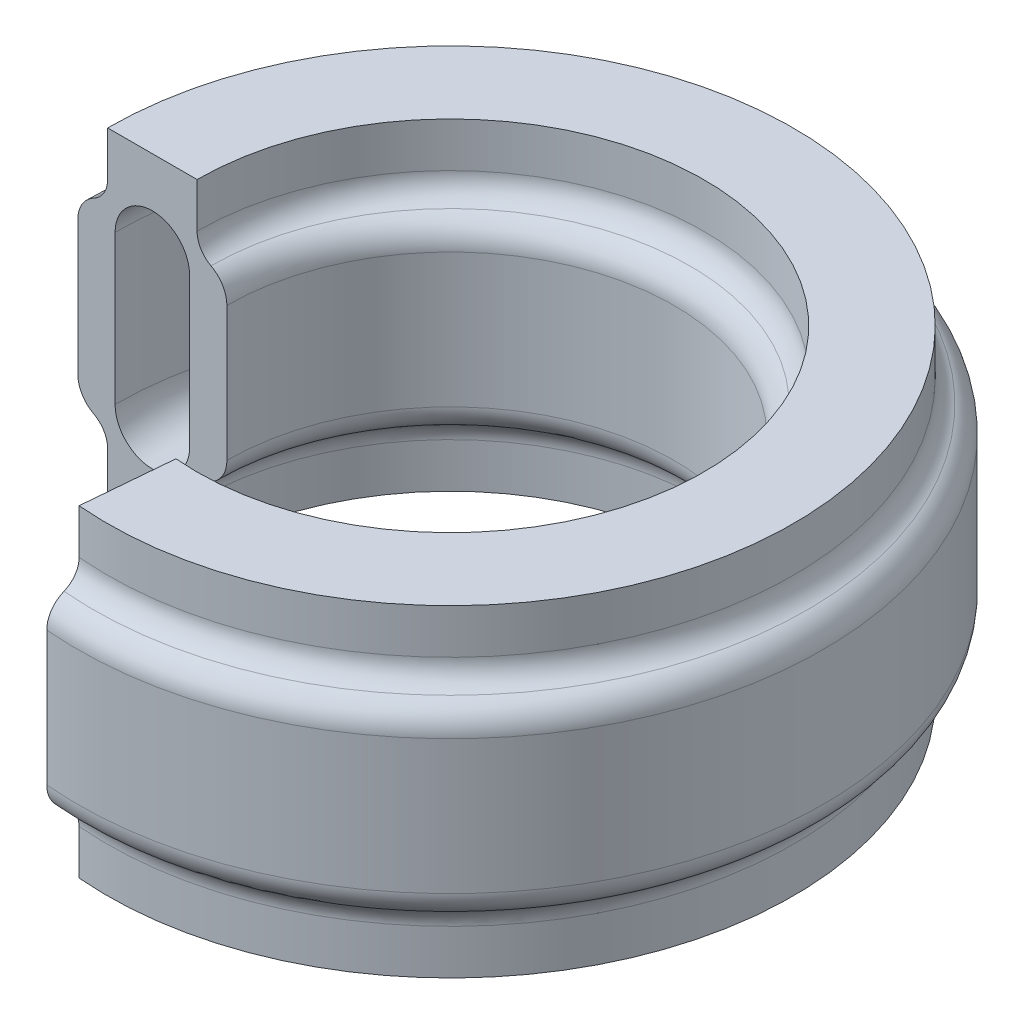
ISO-10303-21;
HEADER;
FILE_DESCRIPTION(('STEP AP214'),'2;1');
FILE_NAME('part.step','',(''),(''),'','','');
FILE_SCHEMA(('AUTOMOTIVE_DESIGN { 1 0 10303 214 1 1 1 1 }'));
ENDSEC;
DATA;
#1=APPLICATION_CONTEXT('core data for automotive mechanical design processes');
#2=APPLICATION_PROTOCOL_DEFINITION('international standard','automotive_design',2000,#1);
#3=PRODUCT_CONTEXT('',#1,'mechanical');
#4=PRODUCT('Part','Part','',(#3));
#5=PRODUCT_RELATED_PRODUCT_CATEGORY('part','',(#4));
#6=PRODUCT_DEFINITION_FORMATION('','',#4);
#7=PRODUCT_DEFINITION_CONTEXT('part definition',#1,'design');
#8=PRODUCT_DEFINITION('design','',#6,#7);
#9=PRODUCT_DEFINITION_SHAPE('','',#8);
#10=(LENGTH_UNIT() NAMED_UNIT(*) SI_UNIT(.MILLI.,.METRE.));
#11=(NAMED_UNIT(*) PLANE_ANGLE_UNIT() SI_UNIT($,.RADIAN.));
#12=(NAMED_UNIT(*) SI_UNIT($,.STERADIAN.) SOLID_ANGLE_UNIT());
#13=UNCERTAINTY_MEASURE_WITH_UNIT(LENGTH_MEASURE(1.E-05),#10,'distance_accuracy_value','');
#14=(GEOMETRIC_REPRESENTATION_CONTEXT(3) GLOBAL_UNCERTAINTY_ASSIGNED_CONTEXT((#13)) GLOBAL_UNIT_ASSIGNED_CONTEXT((#10,
#11,#12)) REPRESENTATION_CONTEXT('',''));
#15=CARTESIAN_POINT('',(0.,0.,0.));
#16=DIRECTION('',(0.,0.,1.));
#17=DIRECTION('',(1.,0.,0.));
#18=AXIS2_PLACEMENT_3D('',#15,#16,#17);
#19=CARTESIAN_POINT('',(0.,5.347797747956,0.));
#20=DIRECTION('',(0.,1.,0.));
#21=DIRECTION('',(-1.,0.,0.));
#22=AXIS2_PLACEMENT_3D('',#19,#20,#21);
#23=TOROIDAL_SURFACE('',#22,20.,2.5);
#24=CARTESIAN_POINT('',(0.,5.347797747956,0.));
#25=DIRECTION('',(0.,1.,0.));
#26=DIRECTION('',(-1.,0.,0.));
#27=AXIS2_PLACEMENT_3D('',#24,#25,#26);
#28=CIRCLE('',#27,22.5);
#29=CARTESIAN_POINT('',(-1.96100421182254,5.347797747956,22.4143807070643));
#30=VERTEX_POINT('',#29);
#31=CARTESIAN_POINT('',(-22.5,5.347797747956,0.));
#32=VERTEX_POINT('',#31);
#33=EDGE_CURVE('E11',#30,#32,#28,.T.);
#34=ORIENTED_EDGE('',*,*,#33,.F.);
#35=CARTESIAN_POINT('',(-1.74311485495337,5.347797747956,19.9238939618349));
#36=DIRECTION('',(0.996194698091745,0.,0.0871557427476685));
#37=DIRECTION('',(0.0871557427476685,0.,-0.996194698091745));
#38=AXIS2_PLACEMENT_3D('',#35,#36,#37);
#39=CIRCLE('',#38,2.5);
#40=CARTESIAN_POINT('',(-1.5252254980842,5.347797747956,17.4334072166055));
#41=VERTEX_POINT('',#40);
#42=EDGE_CURVE('E288',#41,#30,#39,.T.);
#43=ORIENTED_EDGE('',*,*,#42,.F.);
#44=CARTESIAN_POINT('',(0.,5.347797747956,0.));
#45=DIRECTION('',(0.,1.,0.));
#46=DIRECTION('',(-1.,0.,0.));
#47=AXIS2_PLACEMENT_3D('',#44,#45,#46);
#48=CIRCLE('',#47,17.5);
#49=CARTESIAN_POINT('',(-17.5,5.347797747956,0.));
#50=VERTEX_POINT('',#49);
#51=EDGE_CURVE('E328',#41,#50,#48,.T.);
#52=ORIENTED_EDGE('',*,*,#51,.T.);
#53=CARTESIAN_POINT('',(-20.,5.347797747956,0.));
#54=DIRECTION('',(0.,0.,1.));
#55=DIRECTION('',(1.,0.,0.));
#56=AXIS2_PLACEMENT_3D('',#53,#54,#55);
#57=CIRCLE('',#56,2.5);
#58=EDGE_CURVE('E233',#50,#32,#57,.T.);
#59=ORIENTED_EDGE('',*,*,#58,.T.);
#60=EDGE_LOOP('',(#34,#43,#52,#59));
#61=FACE_BOUND('',#60,.T.);
#62=ADVANCED_FACE('F32',(#61),#23,.F.);
#63=CARTESIAN_POINT('',(0.,17.6890628128356,0.));
#64=DIRECTION('',(0.,1.,0.));
#65=DIRECTION('',(-1.,0.,0.));
#66=AXIS2_PLACEMENT_3D('',#63,#64,#65);
#67=CYLINDRICAL_SURFACE('',#66,22.5);
#68=CARTESIAN_POINT('',(0.,-4.65220225204399,0.));
#69=DIRECTION('',(0.,1.,0.));
#70=DIRECTION('',(-1.,0.,0.));
#71=AXIS2_PLACEMENT_3D('',#68,#69,#70);
#72=CIRCLE('',#71,22.5);
#73=CARTESIAN_POINT('',(-1.96100421182254,-4.65220225204399,22.4143807070643));
#74=VERTEX_POINT('',#73);
#75=CARTESIAN_POINT('',(-22.5,-4.652202252044,0.));
#76=VERTEX_POINT('',#75);
#77=EDGE_CURVE('E40',#74,#76,#72,.T.);
#78=ORIENTED_EDGE('',*,*,#77,.F.);
#79=DIRECTION('',(0.,-1.,0.));
#80=VECTOR('',#79,1.);
#81=CARTESIAN_POINT('',(-1.96100421182254,5.347797747956,22.4143807070643));
#82=LINE('',#81,#80);
#83=EDGE_CURVE('E178',#30,#74,#82,.T.);
#84=ORIENTED_EDGE('',*,*,#83,.F.);
#85=ORIENTED_EDGE('',*,*,#33,.T.);
#86=DIRECTION('',(0.,-1.,0.));
#87=VECTOR('',#86,1.);
#88=CARTESIAN_POINT('',(-22.5,5.347797747956,0.));
#89=LINE('',#88,#87);
#90=EDGE_CURVE('E241',#32,#76,#89,.T.);
#91=ORIENTED_EDGE('',*,*,#90,.T.);
#92=EDGE_LOOP('',(#78,#84,#85,#91));
#93=FACE_BOUND('',#92,.T.);
#94=ADVANCED_FACE('F34',(#93),#67,.F.);
#95=CARTESIAN_POINT('',(0.,-4.65220225204399,0.));
#96=DIRECTION('',(0.,1.,0.));
#97=DIRECTION('',(-1.,0.,0.));
#98=AXIS2_PLACEMENT_3D('',#95,#96,#97);
#99=TOROIDAL_SURFACE('',#98,20.,2.5);
#100=CARTESIAN_POINT('',(0.,-4.65220225204399,0.));
#101=DIRECTION('',(0.,1.,0.));
#102=DIRECTION('',(-1.,0.,0.));
#103=AXIS2_PLACEMENT_3D('',#100,#101,#102);
#104=CIRCLE('',#103,17.5);
#105=CARTESIAN_POINT('',(-1.5252254980842,-4.65220225204399,17.4334072166055));
#106=VERTEX_POINT('',#105);
#107=CARTESIAN_POINT('',(-17.5,-4.65220225204399,0.));
#108=VERTEX_POINT('',#107);
#109=EDGE_CURVE('E330',#106,#108,#104,.T.);
#110=ORIENTED_EDGE('',*,*,#109,.F.);
#111=CARTESIAN_POINT('',(-1.74311485495337,-4.65220225204399,19.9238939618349));
#112=DIRECTION('',(0.996194698091745,0.,0.0871557427476685));
#113=DIRECTION('',(-0.0871557427476685,0.,0.996194698091745));
#114=AXIS2_PLACEMENT_3D('',#111,#112,#113);
#115=CIRCLE('',#114,2.5);
#116=EDGE_CURVE('E294',#74,#106,#115,.T.);
#117=ORIENTED_EDGE('',*,*,#116,.F.);
#118=ORIENTED_EDGE('',*,*,#77,.T.);
#119=CARTESIAN_POINT('',(-20.,-4.652202252044,0.));
#120=DIRECTION('',(0.,0.,1.));
#121=DIRECTION('',(-1.,0.,0.));
#122=AXIS2_PLACEMENT_3D('',#119,#120,#121);
#123=CIRCLE('',#122,2.5);
#124=EDGE_CURVE('E238',#76,#108,#123,.T.);
#125=ORIENTED_EDGE('',*,*,#124,.T.);
#126=EDGE_LOOP('',(#110,#117,#118,#125));
#127=FACE_BOUND('',#126,.T.);
#128=ADVANCED_FACE('F333',(#127),#99,.F.);
#129=CARTESIAN_POINT('',(0.,17.6890628128356,0.));
#130=DIRECTION('',(0.,1.,0.));
#131=DIRECTION('',(-1.,0.,0.));
#132=AXIS2_PLACEMENT_3D('',#129,#130,#131);
#133=CYLINDRICAL_SURFACE('',#132,23.);
#134=CARTESIAN_POINT('',(0.,11.1644225383114,0.));
#135=DIRECTION('',(0.,1.,0.));
#136=DIRECTION('',(-1.,0.,0.));
#137=AXIS2_PLACEMENT_3D('',#134,#135,#136);
#138=CIRCLE('',#137,23.);
#139=CARTESIAN_POINT('',(-2.00458208319638,11.1644225383114,22.9124780561101));
#140=VERTEX_POINT('',#139);
#141=CARTESIAN_POINT('',(-23.,11.1644225383114,0.));
#142=VERTEX_POINT('',#141);
#143=EDGE_CURVE('E326',#140,#142,#138,.T.);
#144=ORIENTED_EDGE('',*,*,#143,.F.);
#145=DIRECTION('',(0.,-1.,0.));
#146=VECTOR('',#145,1.);
#147=CARTESIAN_POINT('',(-2.00458208319638,11.1644225383114,22.9124780561101));
#148=LINE('',#147,#146);
#149=CARTESIAN_POINT('',(-2.00458208319637,8.1644225383114,22.9124780561101));
#150=VERTEX_POINT('',#149);
#151=EDGE_CURVE('E173',#140,#150,#148,.T.);
#152=ORIENTED_EDGE('',*,*,#151,.T.);
#153=CARTESIAN_POINT('',(0.,8.1644225383114,0.));
#154=DIRECTION('',(0.,1.,0.));
#155=DIRECTION('',(-1.,0.,0.));
#156=AXIS2_PLACEMENT_3D('',#153,#154,#155);
#157=CIRCLE('',#156,23.);
#158=CARTESIAN_POINT('',(-23.,8.1644225383114,0.));
#159=VERTEX_POINT('',#158);
#160=EDGE_CURVE('E167',#150,#159,#157,.T.);
#161=ORIENTED_EDGE('',*,*,#160,.T.);
#162=DIRECTION('',(0.,-1.,0.));
#163=VECTOR('',#162,1.);
#164=CARTESIAN_POINT('',(-23.,11.1644225383114,0.));
#165=LINE('',#164,#163);
#166=EDGE_CURVE('E171',#142,#159,#165,.T.);
#167=ORIENTED_EDGE('',*,*,#166,.F.);
#168=EDGE_LOOP('',(#144,#152,#161,#167));
#169=FACE_BOUND('',#168,.T.);
#170=ADVANCED_FACE('F169',(#169),#133,.T.);
#171=CARTESIAN_POINT('',(-1.48164762671036,11.1644225383114,16.9353098675597));
#172=DIRECTION('',(0.,1.,0.));
#173=DIRECTION('',(-1.,0.,0.));
#174=AXIS2_PLACEMENT_3D('',#171,#172,#173);
#175=PLANE('',#174);
#176=CARTESIAN_POINT('',(0.,11.1644225383114,0.));
#177=DIRECTION('',(0.,1.,0.));
#178=DIRECTION('',(-1.,0.,0.));
#179=AXIS2_PLACEMENT_3D('',#176,#177,#178);
#180=CIRCLE('',#179,17.);
#181=CARTESIAN_POINT('',(-1.48164762671036,11.1644225383114,16.9353098675597));
#182=VERTEX_POINT('',#181);
#183=CARTESIAN_POINT('',(-17.,11.1644225383114,0.));
#184=VERTEX_POINT('',#183);
#185=EDGE_CURVE('E324',#182,#184,#180,.T.);
#186=ORIENTED_EDGE('',*,*,#185,.F.);
#187=DIRECTION('',(-0.0871557427476685,0.,0.996194698091745));
#188=VECTOR('',#187,1.);
#189=CARTESIAN_POINT('',(-1.48164762671036,11.1644225383114,16.9353098675597));
#190=LINE('',#189,#188);
#191=EDGE_CURVE('E285',#182,#140,#190,.T.);
#192=ORIENTED_EDGE('',*,*,#191,.T.);
#193=ORIENTED_EDGE('',*,*,#143,.T.);
#194=DIRECTION('',(-1.,0.,0.));
#195=VECTOR('',#194,1.);
#196=CARTESIAN_POINT('',(-17.,11.1644225383114,0.));
#197=LINE('',#196,#195);
#198=EDGE_CURVE('E193',#184,#142,#197,.T.);
#199=ORIENTED_EDGE('',*,*,#198,.F.);
#200=EDGE_LOOP('',(#186,#192,#193,#199));
#201=FACE_BOUND('',#200,.T.);
#202=ADVANCED_FACE('F358',(#201),#175,.T.);
#203=CARTESIAN_POINT('',(0.,17.6890628128356,0.));
#204=DIRECTION('',(0.,1.,0.));
#205=DIRECTION('',(-1.,0.,0.));
#206=AXIS2_PLACEMENT_3D('',#203,#204,#205);
#207=CYLINDRICAL_SURFACE('',#206,17.);
#208=CARTESIAN_POINT('',(0.,8.1644225383114,0.));
#209=DIRECTION('',(0.,1.,0.));
#210=DIRECTION('',(-1.,0.,0.));
#211=AXIS2_PLACEMENT_3D('',#208,#209,#210);
#212=CIRCLE('',#211,17.);
#213=CARTESIAN_POINT('',(-1.48164762671036,8.1644225383114,16.9353098675597));
#214=VERTEX_POINT('',#213);
#215=CARTESIAN_POINT('',(-17.,8.1644225383114,0.));
#216=VERTEX_POINT('',#215);
#217=EDGE_CURVE('E322',#214,#216,#212,.T.);
#218=ORIENTED_EDGE('',*,*,#217,.F.);
#219=DIRECTION('',(0.,1.,0.));
#220=VECTOR('',#219,1.);
#221=CARTESIAN_POINT('',(-1.48164762671036,11.1644225383114,16.9353098675597));
#222=LINE('',#221,#220);
#223=EDGE_CURVE('E282',#214,#182,#222,.T.);
#224=ORIENTED_EDGE('',*,*,#223,.T.);
#225=ORIENTED_EDGE('',*,*,#185,.T.);
#226=DIRECTION('',(0.,1.,0.));
#227=VECTOR('',#226,1.);
#228=CARTESIAN_POINT('',(-17.,11.1644225383114,0.));
#229=LINE('',#228,#227);
#230=EDGE_CURVE('E230',#216,#184,#229,.T.);
#231=ORIENTED_EDGE('',*,*,#230,.F.);
#232=EDGE_LOOP('',(#218,#224,#225,#231));
#233=FACE_BOUND('',#232,.T.);
#234=ADVANCED_FACE('F361',(#233),#207,.F.);
#235=CARTESIAN_POINT('',(0.,8.1644225383114,0.));
#236=DIRECTION('',(0.,1.,0.));
#237=DIRECTION('',(-1.,0.,0.));
#238=AXIS2_PLACEMENT_3D('',#235,#236,#237);
#239=TOROIDAL_SURFACE('',#238,15.25,1.75);
#240=CARTESIAN_POINT('',(0.,6.61666430281221,0.));
#241=DIRECTION('',(0.,1.,0.));
#242=DIRECTION('',(-1.,0.,0.));
#243=AXIS2_PLACEMENT_3D('',#240,#241,#242);
#244=CIRCLE('',#243,16.0666666666667);
#245=CARTESIAN_POINT('',(-1.40030226681254,6.61666430281221,16.0055281493407));
#246=VERTEX_POINT('',#245);
#247=CARTESIAN_POINT('',(-16.0666666666667,6.61666430281221,0.));
#248=VERTEX_POINT('',#247);
#249=EDGE_CURVE('E320',#246,#248,#244,.T.);
#250=ORIENTED_EDGE('',*,*,#249,.F.);
#251=CARTESIAN_POINT('',(-1.32912507690194,8.1644225383114,15.1919691458991));
#252=DIRECTION('',(-0.996194698091745,0.,-0.0871557427476685));
#253=DIRECTION('',(0.0871557427476685,0.,-0.996194698091745));
#254=AXIS2_PLACEMENT_3D('',#251,#252,#253);
#255=CIRCLE('',#254,1.75);
#256=EDGE_CURVE('E279',#246,#214,#255,.T.);
#257=ORIENTED_EDGE('',*,*,#256,.T.);
#258=ORIENTED_EDGE('',*,*,#217,.T.);
#259=CARTESIAN_POINT('',(-15.25,8.1644225383114,0.));
#260=DIRECTION('',(0.,0.,-1.));
#261=DIRECTION('',(1.,0.,0.));
#262=AXIS2_PLACEMENT_3D('',#259,#260,#261);
#263=CIRCLE('',#262,1.75);
#264=EDGE_CURVE('E227',#248,#216,#263,.T.);
#265=ORIENTED_EDGE('',*,*,#264,.F.);
#266=EDGE_LOOP('',(#250,#257,#258,#265));
#267=FACE_BOUND('',#266,.T.);
#268=ADVANCED_FACE('F365',(#267),#239,.F.);
#269=CARTESIAN_POINT('',(0.,4.847797747956,0.));
#270=DIRECTION('',(0.,1.,0.));
#271=DIRECTION('',(-1.,0.,0.));
#272=AXIS2_PLACEMENT_3D('',#269,#270,#271);
#273=TOROIDAL_SURFACE('',#272,17.,2.);
#274=CARTESIAN_POINT('',(0.,4.847797747956,0.));
#275=DIRECTION('',(0.,1.,0.));
#276=DIRECTION('',(-1.,0.,0.));
#277=AXIS2_PLACEMENT_3D('',#274,#275,#276);
#278=CIRCLE('',#277,15.);
#279=CARTESIAN_POINT('',(-1.30733614121503,4.847797747956,14.9429204713762));
#280=VERTEX_POINT('',#279);
#281=CARTESIAN_POINT('',(-15.,4.847797747956,0.));
#282=VERTEX_POINT('',#281);
#283=EDGE_CURVE('E318',#280,#282,#278,.T.);
#284=ORIENTED_EDGE('',*,*,#283,.F.);
#285=CARTESIAN_POINT('',(-1.48164762671036,4.847797747956,16.9353098675597));
#286=DIRECTION('',(0.996194698091745,0.,0.0871557427476685));
#287=DIRECTION('',(-0.0871557427476685,0.,0.996194698091745));
#288=AXIS2_PLACEMENT_3D('',#285,#286,#287);
#289=CIRCLE('',#288,2.);
#290=EDGE_CURVE('E276',#280,#246,#289,.T.);
#291=ORIENTED_EDGE('',*,*,#290,.T.);
#292=ORIENTED_EDGE('',*,*,#249,.T.);
#293=CARTESIAN_POINT('',(-17.,4.847797747956,0.));
#294=DIRECTION('',(0.,0.,1.));
#295=DIRECTION('',(-1.,0.,0.));
#296=AXIS2_PLACEMENT_3D('',#293,#294,#295);
#297=CIRCLE('',#296,2.);
#298=EDGE_CURVE('E224',#282,#248,#297,.T.);
#299=ORIENTED_EDGE('',*,*,#298,.F.);
#300=EDGE_LOOP('',(#284,#291,#292,#299));
#301=FACE_BOUND('',#300,.T.);
#302=ADVANCED_FACE('F369',(#301),#273,.T.);
#303=CARTESIAN_POINT('',(0.,17.6890628128356,0.));
#304=DIRECTION('',(0.,1.,0.));
#305=DIRECTION('',(-1.,0.,0.));
#306=AXIS2_PLACEMENT_3D('',#303,#304,#305);
#307=CYLINDRICAL_SURFACE('',#306,15.);
#308=CARTESIAN_POINT('',(0.,-4.152202252044,0.));
#309=DIRECTION('',(0.,1.,0.));
#310=DIRECTION('',(-1.,0.,0.));
#311=AXIS2_PLACEMENT_3D('',#308,#309,#310);
#312=CIRCLE('',#311,15.);
#313=CARTESIAN_POINT('',(-1.30733614121503,-4.152202252044,14.9429204713762));
#314=VERTEX_POINT('',#313);
#315=CARTESIAN_POINT('',(-15.,-4.152202252044,0.));
#316=VERTEX_POINT('',#315);
#317=EDGE_CURVE('E316',#314,#316,#312,.T.);
#318=ORIENTED_EDGE('',*,*,#317,.F.);
#319=DIRECTION('',(0.,1.,0.));
#320=VECTOR('',#319,1.);
#321=CARTESIAN_POINT('',(-1.30733614121503,4.847797747956,14.9429204713762));
#322=LINE('',#321,#320);
#323=EDGE_CURVE('E273',#314,#280,#322,.T.);
#324=ORIENTED_EDGE('',*,*,#323,.T.);
#325=ORIENTED_EDGE('',*,*,#283,.T.);
#326=DIRECTION('',(0.,1.,0.));
#327=VECTOR('',#326,1.);
#328=CARTESIAN_POINT('',(-15.,4.847797747956,0.));
#329=LINE('',#328,#327);
#330=EDGE_CURVE('E221',#316,#282,#329,.T.);
#331=ORIENTED_EDGE('',*,*,#330,.F.);
#332=EDGE_LOOP('',(#318,#324,#325,#331));
#333=FACE_BOUND('',#332,.T.);
#334=ADVANCED_FACE('F373',(#333),#307,.F.);
#335=CARTESIAN_POINT('',(0.,-4.152202252044,0.));
#336=DIRECTION('',(0.,1.,0.));
#337=DIRECTION('',(-1.,0.,0.));
#338=AXIS2_PLACEMENT_3D('',#335,#336,#337);
#339=TOROIDAL_SURFACE('',#338,17.,2.);
#340=CARTESIAN_POINT('',(0.,-5.92106880690021,0.));
#341=DIRECTION('',(0.,1.,0.));
#342=DIRECTION('',(-1.,0.,0.));
#343=AXIS2_PLACEMENT_3D('',#340,#341,#342);
#344=CIRCLE('',#343,16.0666666666667);
#345=CARTESIAN_POINT('',(-1.40030226681254,-5.92106880690021,16.0055281493407));
#346=VERTEX_POINT('',#345);
#347=CARTESIAN_POINT('',(-16.0666666666667,-5.92106880690021,0.));
#348=VERTEX_POINT('',#347);
#349=EDGE_CURVE('E314',#346,#348,#344,.T.);
#350=ORIENTED_EDGE('',*,*,#349,.F.);
#351=CARTESIAN_POINT('',(-1.48164762671036,-4.152202252044,16.9353098675597));
#352=DIRECTION('',(0.996194698091745,0.,0.0871557427476685));
#353=DIRECTION('',(-0.0871557427476685,0.,0.996194698091745));
#354=AXIS2_PLACEMENT_3D('',#351,#352,#353);
#355=CIRCLE('',#354,2.);
#356=EDGE_CURVE('E270',#346,#314,#355,.T.);
#357=ORIENTED_EDGE('',*,*,#356,.T.);
#358=ORIENTED_EDGE('',*,*,#317,.T.);
#359=CARTESIAN_POINT('',(-17.,-4.152202252044,0.));
#360=DIRECTION('',(0.,0.,1.));
#361=DIRECTION('',(-1.,0.,0.));
#362=AXIS2_PLACEMENT_3D('',#359,#360,#361);
#363=CIRCLE('',#362,2.);
#364=EDGE_CURVE('E218',#348,#316,#363,.T.);
#365=ORIENTED_EDGE('',*,*,#364,.F.);
#366=EDGE_LOOP('',(#350,#357,#358,#365));
#367=FACE_BOUND('',#366,.T.);
#368=ADVANCED_FACE('F377',(#367),#339,.T.);
#369=CARTESIAN_POINT('',(0.,-7.46882704239939,0.));
#370=DIRECTION('',(0.,1.,0.));
#371=DIRECTION('',(-1.,0.,0.));
#372=AXIS2_PLACEMENT_3D('',#369,#370,#371);
#373=TOROIDAL_SURFACE('',#372,15.25,1.75);
#374=CARTESIAN_POINT('',(0.,-7.46882704239939,0.));
#375=DIRECTION('',(0.,1.,0.));
#376=DIRECTION('',(-1.,0.,0.));
#377=AXIS2_PLACEMENT_3D('',#374,#375,#376);
#378=CIRCLE('',#377,17.);
#379=CARTESIAN_POINT('',(-1.48164762671036,-7.46882704239939,16.9353098675597));
#380=VERTEX_POINT('',#379);
#381=CARTESIAN_POINT('',(-17.,-7.46882704239939,0.));
#382=VERTEX_POINT('',#381);
#383=EDGE_CURVE('E312',#380,#382,#378,.T.);
#384=ORIENTED_EDGE('',*,*,#383,.F.);
#385=CARTESIAN_POINT('',(-1.32912507690194,-7.46882704239939,15.1919691458991));
#386=DIRECTION('',(-0.996194698091745,0.,-0.0871557427476685));
#387=DIRECTION('',(-0.0871557427476685,0.,0.996194698091745));
#388=AXIS2_PLACEMENT_3D('',#385,#386,#387);
#389=CIRCLE('',#388,1.75);
#390=EDGE_CURVE('E267',#380,#346,#389,.T.);
#391=ORIENTED_EDGE('',*,*,#390,.T.);
#392=ORIENTED_EDGE('',*,*,#349,.T.);
#393=CARTESIAN_POINT('',(-15.25,-7.46882704239939,0.));
#394=DIRECTION('',(0.,0.,-1.));
#395=DIRECTION('',(-1.,0.,0.));
#396=AXIS2_PLACEMENT_3D('',#393,#394,#395);
#397=CIRCLE('',#396,1.75);
#398=EDGE_CURVE('E215',#382,#348,#397,.T.);
#399=ORIENTED_EDGE('',*,*,#398,.F.);
#400=EDGE_LOOP('',(#384,#391,#392,#399));
#401=FACE_BOUND('',#400,.T.);
#402=ADVANCED_FACE('F381',(#401),#373,.F.);
#403=CARTESIAN_POINT('',(0.,17.6890628128356,0.));
#404=DIRECTION('',(0.,1.,0.));
#405=DIRECTION('',(-1.,0.,0.));
#406=AXIS2_PLACEMENT_3D('',#403,#404,#405);
#407=CYLINDRICAL_SURFACE('',#406,17.);
#408=CARTESIAN_POINT('',(0.,-10.4688270423994,0.));
#409=DIRECTION('',(0.,1.,0.));
#410=DIRECTION('',(-1.,0.,0.));
#411=AXIS2_PLACEMENT_3D('',#408,#409,#410);
#412=CIRCLE('',#411,17.);
#413=CARTESIAN_POINT('',(-1.48164762671036,-10.4688270423994,16.9353098675597));
#414=VERTEX_POINT('',#413);
#415=CARTESIAN_POINT('',(-17.,-10.4688270423994,0.));
#416=VERTEX_POINT('',#415);
#417=EDGE_CURVE('E310',#414,#416,#412,.T.);
#418=ORIENTED_EDGE('',*,*,#417,.F.);
#419=DIRECTION('',(0.,1.,0.));
#420=VECTOR('',#419,1.);
#421=CARTESIAN_POINT('',(-1.48164762671036,-10.4688270423994,16.9353098675597));
#422=LINE('',#421,#420);
#423=EDGE_CURVE('E264',#414,#380,#422,.T.);
#424=ORIENTED_EDGE('',*,*,#423,.T.);
#425=ORIENTED_EDGE('',*,*,#383,.T.);
#426=DIRECTION('',(0.,1.,0.));
#427=VECTOR('',#426,1.);
#428=CARTESIAN_POINT('',(-17.,-10.4688270423994,0.));
#429=LINE('',#428,#427);
#430=EDGE_CURVE('E212',#416,#382,#429,.T.);
#431=ORIENTED_EDGE('',*,*,#430,.F.);
#432=EDGE_LOOP('',(#418,#424,#425,#431));
#433=FACE_BOUND('',#432,.T.);
#434=ADVANCED_FACE('F385',(#433),#407,.F.);
#435=CARTESIAN_POINT('',(-1.48164762671036,-10.4688270423994,16.9353098675597));
#436=DIRECTION('',(0.,-1.,0.));
#437=DIRECTION('',(1.,0.,0.));
#438=AXIS2_PLACEMENT_3D('',#435,#436,#437);
#439=PLANE('',#438);
#440=CARTESIAN_POINT('',(0.,-10.4688270423994,0.));
#441=DIRECTION('',(0.,1.,0.));
#442=DIRECTION('',(-1.,0.,0.));
#443=AXIS2_PLACEMENT_3D('',#440,#441,#442);
#444=CIRCLE('',#443,23.);
#445=CARTESIAN_POINT('',(-2.00458208319637,-10.4688270423994,22.9124780561101));
#446=VERTEX_POINT('',#445);
#447=CARTESIAN_POINT('',(-23.,-10.4688270423994,0.));
#448=VERTEX_POINT('',#447);
#449=EDGE_CURVE('E308',#446,#448,#444,.T.);
#450=ORIENTED_EDGE('',*,*,#449,.F.);
#451=DIRECTION('',(0.0871557427476685,0.,-0.996194698091745));
#452=VECTOR('',#451,1.);
#453=CARTESIAN_POINT('',(-1.48164762671036,-10.4688270423994,16.9353098675597));
#454=LINE('',#453,#452);
#455=EDGE_CURVE('E261',#446,#414,#454,.T.);
#456=ORIENTED_EDGE('',*,*,#455,.T.);
#457=ORIENTED_EDGE('',*,*,#417,.T.);
#458=DIRECTION('',(1.,0.,0.));
#459=VECTOR('',#458,1.);
#460=CARTESIAN_POINT('',(-17.,-10.4688270423994,0.));
#461=LINE('',#460,#459);
#462=EDGE_CURVE('E209',#448,#416,#461,.T.);
#463=ORIENTED_EDGE('',*,*,#462,.F.);
#464=EDGE_LOOP('',(#450,#456,#457,#463));
#465=FACE_BOUND('',#464,.T.);
#466=ADVANCED_FACE('F389',(#465),#439,.T.);
#467=CARTESIAN_POINT('',(0.,17.6890628128356,0.));
#468=DIRECTION('',(0.,1.,0.));
#469=DIRECTION('',(-1.,0.,0.));
#470=AXIS2_PLACEMENT_3D('',#467,#468,#469);
#471=CYLINDRICAL_SURFACE('',#470,23.);
#472=CARTESIAN_POINT('',(0.,-7.46882704239939,0.));
#473=DIRECTION('',(0.,1.,0.));
#474=DIRECTION('',(-1.,0.,0.));
#475=AXIS2_PLACEMENT_3D('',#472,#473,#474);
#476=CIRCLE('',#475,23.);
#477=CARTESIAN_POINT('',(-2.00458208319637,-7.46882704239939,22.9124780561101));
#478=VERTEX_POINT('',#477);
#479=CARTESIAN_POINT('',(-23.,-7.46882704239939,0.));
#480=VERTEX_POINT('',#479);
#481=EDGE_CURVE('E306',#478,#480,#476,.T.);
#482=ORIENTED_EDGE('',*,*,#481,.F.);
#483=DIRECTION('',(0.,-1.,0.));
#484=VECTOR('',#483,1.);
#485=CARTESIAN_POINT('',(-2.00458208319637,-10.4688270423994,22.9124780561101));
#486=LINE('',#485,#484);
#487=EDGE_CURVE('E258',#478,#446,#486,.T.);
#488=ORIENTED_EDGE('',*,*,#487,.T.);
#489=ORIENTED_EDGE('',*,*,#449,.T.);
#490=DIRECTION('',(0.,-1.,0.));
#491=VECTOR('',#490,1.);
#492=CARTESIAN_POINT('',(-23.,-10.4688270423994,0.));
#493=LINE('',#492,#491);
#494=EDGE_CURVE('E206',#480,#448,#493,.T.);
#495=ORIENTED_EDGE('',*,*,#494,.F.);
#496=EDGE_LOOP('',(#482,#488,#489,#495));
#497=FACE_BOUND('',#496,.T.);
#498=ADVANCED_FACE('F393',(#497),#471,.T.);
#499=CARTESIAN_POINT('',(0.,-7.46882704239939,0.));
#500=DIRECTION('',(0.,1.,0.));
#501=DIRECTION('',(-1.,0.,0.));
#502=AXIS2_PLACEMENT_3D('',#499,#500,#501);
#503=TOROIDAL_SURFACE('',#502,24.75,1.75);
#504=CARTESIAN_POINT('',(0.,-5.9210688069002,0.));
#505=DIRECTION('',(0.,1.,0.));
#506=DIRECTION('',(-1.,0.,0.));
#507=AXIS2_PLACEMENT_3D('',#504,#505,#506);
#508=CIRCLE('',#507,23.9333333333333);
#509=CARTESIAN_POINT('',(-2.0859274430942,-5.9210688069002,23.8422597743291));
#510=VERTEX_POINT('',#509);
#511=CARTESIAN_POINT('',(-23.9333333333333,-5.92106880690021,0.));
#512=VERTEX_POINT('',#511);
#513=EDGE_CURVE('E304',#510,#512,#508,.T.);
#514=ORIENTED_EDGE('',*,*,#513,.F.);
#515=CARTESIAN_POINT('',(-2.15710463300479,-7.46882704239939,24.6558187777707));
#516=DIRECTION('',(-0.996194698091745,0.,-0.0871557427476685));
#517=DIRECTION('',(0.0871557427476685,0.,-0.996194698091745));
#518=AXIS2_PLACEMENT_3D('',#515,#516,#517);
#519=CIRCLE('',#518,1.75);
#520=EDGE_CURVE('E255',#510,#478,#519,.T.);
#521=ORIENTED_EDGE('',*,*,#520,.T.);
#522=ORIENTED_EDGE('',*,*,#481,.T.);
#523=CARTESIAN_POINT('',(-24.75,-7.46882704239939,0.));
#524=DIRECTION('',(0.,0.,-1.));
#525=DIRECTION('',(1.,0.,0.));
#526=AXIS2_PLACEMENT_3D('',#523,#524,#525);
#527=CIRCLE('',#526,1.75);
#528=EDGE_CURVE('E203',#512,#480,#527,.T.);
#529=ORIENTED_EDGE('',*,*,#528,.F.);
#530=EDGE_LOOP('',(#514,#521,#522,#529));
#531=FACE_BOUND('',#530,.T.);
#532=ADVANCED_FACE('F397',(#531),#503,.F.);
#533=CARTESIAN_POINT('',(0.,-4.15220225204399,0.));
#534=DIRECTION('',(0.,1.,0.));
#535=DIRECTION('',(-1.,0.,0.));
#536=AXIS2_PLACEMENT_3D('',#533,#534,#535);
#537=TOROIDAL_SURFACE('',#536,23.,2.);
#538=CARTESIAN_POINT('',(0.,-4.15220225204399,0.));
#539=DIRECTION('',(0.,1.,0.));
#540=DIRECTION('',(-1.,0.,0.));
#541=AXIS2_PLACEMENT_3D('',#538,#539,#540);
#542=CIRCLE('',#541,25.);
#543=CARTESIAN_POINT('',(-2.17889356869171,-4.15220225204399,24.9048674522936));
#544=VERTEX_POINT('',#543);
#545=CARTESIAN_POINT('',(-25.,-4.15220225204399,0.));
#546=VERTEX_POINT('',#545);
#547=EDGE_CURVE('E302',#544,#546,#542,.T.);
#548=ORIENTED_EDGE('',*,*,#547,.F.);
#549=CARTESIAN_POINT('',(-2.00458208319637,-4.15220225204399,22.9124780561101));
#550=DIRECTION('',(0.996194698091745,0.,0.0871557427476685));
#551=DIRECTION('',(0.0871557427476685,0.,-0.996194698091745));
#552=AXIS2_PLACEMENT_3D('',#549,#550,#551);
#553=CIRCLE('',#552,2.);
#554=EDGE_CURVE('E252',#544,#510,#553,.T.);
#555=ORIENTED_EDGE('',*,*,#554,.T.);
#556=ORIENTED_EDGE('',*,*,#513,.T.);
#557=CARTESIAN_POINT('',(-23.,-4.152202252044,0.));
#558=DIRECTION('',(0.,0.,1.));
#559=DIRECTION('',(1.,0.,0.));
#560=AXIS2_PLACEMENT_3D('',#557,#558,#559);
#561=CIRCLE('',#560,2.);
#562=EDGE_CURVE('E200',#546,#512,#561,.T.);
#563=ORIENTED_EDGE('',*,*,#562,.F.);
#564=EDGE_LOOP('',(#548,#555,#556,#563));
#565=FACE_BOUND('',#564,.T.);
#566=ADVANCED_FACE('F401',(#565),#537,.T.);
#567=CARTESIAN_POINT('',(0.,17.6890628128356,0.));
#568=DIRECTION('',(0.,1.,0.));
#569=DIRECTION('',(-1.,0.,0.));
#570=AXIS2_PLACEMENT_3D('',#567,#568,#569);
#571=CYLINDRICAL_SURFACE('',#570,25.);
#572=CARTESIAN_POINT('',(0.,4.847797747956,0.));
#573=DIRECTION('',(0.,1.,0.));
#574=DIRECTION('',(-1.,0.,0.));
#575=AXIS2_PLACEMENT_3D('',#572,#573,#574);
#576=CIRCLE('',#575,25.);
#577=CARTESIAN_POINT('',(-2.17889356869171,4.847797747956,24.9048674522936));
#578=VERTEX_POINT('',#577);
#579=CARTESIAN_POINT('',(-25.,4.847797747956,0.));
#580=VERTEX_POINT('',#579);
#581=EDGE_CURVE('E300',#578,#580,#576,.T.);
#582=ORIENTED_EDGE('',*,*,#581,.F.);
#583=DIRECTION('',(0.,-1.,0.));
#584=VECTOR('',#583,1.);
#585=CARTESIAN_POINT('',(-2.17889356869171,4.847797747956,24.9048674522936));
#586=LINE('',#585,#584);
#587=EDGE_CURVE('E249',#578,#544,#586,.T.);
#588=ORIENTED_EDGE('',*,*,#587,.T.);
#589=ORIENTED_EDGE('',*,*,#547,.T.);
#590=DIRECTION('',(0.,-1.,0.));
#591=VECTOR('',#590,1.);
#592=CARTESIAN_POINT('',(-25.,4.847797747956,0.));
#593=LINE('',#592,#591);
#594=EDGE_CURVE('E197',#580,#546,#593,.T.);
#595=ORIENTED_EDGE('',*,*,#594,.F.);
#596=EDGE_LOOP('',(#582,#588,#589,#595));
#597=FACE_BOUND('',#596,.T.);
#598=ADVANCED_FACE('F405',(#597),#571,.T.);
#599=CARTESIAN_POINT('',(0.,4.847797747956,0.));
#600=DIRECTION('',(0.,1.,0.));
#601=DIRECTION('',(-1.,0.,0.));
#602=AXIS2_PLACEMENT_3D('',#599,#600,#601);
#603=TOROIDAL_SURFACE('',#602,23.,2.);
#604=CARTESIAN_POINT('',(0.,6.61666430281221,0.));
#605=DIRECTION('',(0.,1.,0.));
#606=DIRECTION('',(-1.,0.,0.));
#607=AXIS2_PLACEMENT_3D('',#604,#605,#606);
#608=CIRCLE('',#607,23.9333333333333);
#609=CARTESIAN_POINT('',(-2.0859274430942,6.61666430281221,23.8422597743291));
#610=VERTEX_POINT('',#609);
#611=CARTESIAN_POINT('',(-23.9333333333333,6.61666430281221,0.));
#612=VERTEX_POINT('',#611);
#613=EDGE_CURVE('E177',#610,#612,#608,.T.);
#614=ORIENTED_EDGE('',*,*,#613,.F.);
#615=CARTESIAN_POINT('',(-2.00458208319637,4.847797747956,22.9124780561101));
#616=DIRECTION('',(0.996194698091745,0.,0.0871557427476685));
#617=DIRECTION('',(0.0871557427476685,0.,-0.996194698091745));
#618=AXIS2_PLACEMENT_3D('',#615,#616,#617);
#619=CIRCLE('',#618,2.);
#620=EDGE_CURVE('E246',#610,#578,#619,.T.);
#621=ORIENTED_EDGE('',*,*,#620,.T.);
#622=ORIENTED_EDGE('',*,*,#581,.T.);
#623=CARTESIAN_POINT('',(-23.,4.847797747956,0.));
#624=DIRECTION('',(0.,0.,1.));
#625=DIRECTION('',(1.,0.,0.));
#626=AXIS2_PLACEMENT_3D('',#623,#624,#625);
#627=CIRCLE('',#626,2.);
#628=EDGE_CURVE('E186',#612,#580,#627,.T.);
#629=ORIENTED_EDGE('',*,*,#628,.F.);
#630=EDGE_LOOP('',(#614,#621,#622,#629));
#631=FACE_BOUND('',#630,.T.);
#632=ADVANCED_FACE('F350',(#631),#603,.T.);
#633=CARTESIAN_POINT('',(0.,8.1644225383114,0.));
#634=DIRECTION('',(0.,1.,0.));
#635=DIRECTION('',(-1.,0.,0.));
#636=AXIS2_PLACEMENT_3D('',#633,#634,#635);
#637=TOROIDAL_SURFACE('',#636,24.75,1.75);
#638=CARTESIAN_POINT('',(-2.15710463300479,8.1644225383114,24.6558187777707));
#639=DIRECTION('',(-0.996194698091745,0.,-0.0871557427476685));
#640=DIRECTION('',(-0.0871557427476685,0.,0.996194698091745));
#641=AXIS2_PLACEMENT_3D('',#638,#639,#640);
#642=CIRCLE('',#641,1.75);
#643=EDGE_CURVE('E244',#150,#610,#642,.T.);
#644=ORIENTED_EDGE('',*,*,#643,.T.);
#645=ORIENTED_EDGE('',*,*,#613,.T.);
#646=CARTESIAN_POINT('',(-24.75,8.1644225383114,0.));
#647=DIRECTION('',(0.,0.,-1.));
#648=DIRECTION('',(-1.,0.,0.));
#649=AXIS2_PLACEMENT_3D('',#646,#647,#648);
#650=CIRCLE('',#649,1.75);
#651=EDGE_CURVE('E181',#159,#612,#650,.T.);
#652=ORIENTED_EDGE('',*,*,#651,.F.);
#653=ORIENTED_EDGE('',*,*,#160,.F.);
#654=EDGE_LOOP('',(#644,#645,#652,#653));
#655=FACE_BOUND('',#654,.T.);
#656=ADVANCED_FACE('F182',(#655),#637,.F.);
#657=CARTESIAN_POINT('',(0.,17.6890628128356,0.));
#658=DIRECTION('',(0.,1.,0.));
#659=DIRECTION('',(-1.,0.,0.));
#660=AXIS2_PLACEMENT_3D('',#657,#658,#659);
#661=CYLINDRICAL_SURFACE('',#660,17.5);
#662=DIRECTION('',(0.,1.,0.));
#663=VECTOR('',#662,1.);
#664=CARTESIAN_POINT('',(-1.5252254980842,5.347797747956,17.4334072166055));
#665=LINE('',#664,#663);
#666=EDGE_CURVE('E291',#106,#41,#665,.T.);
#667=ORIENTED_EDGE('',*,*,#666,.F.);
#668=ORIENTED_EDGE('',*,*,#109,.T.);
#669=DIRECTION('',(0.,1.,0.));
#670=VECTOR('',#669,1.);
#671=CARTESIAN_POINT('',(-17.5,5.347797747956,0.));
#672=LINE('',#671,#670);
#673=EDGE_CURVE('E235',#108,#50,#672,.T.);
#674=ORIENTED_EDGE('',*,*,#673,.T.);
#675=ORIENTED_EDGE('',*,*,#51,.F.);
#676=EDGE_LOOP('',(#667,#668,#674,#675));
#677=FACE_BOUND('',#676,.T.);
#678=ADVANCED_FACE('F341',(#677),#661,.T.);
#679=CARTESIAN_POINT('',(-2.15710463300479,8.1644225383114,24.6558187777707));
#680=DIRECTION('',(-0.996194698091745,0.,-0.0871557427476685));
#681=DIRECTION('',(-0.0871557427476685,0.,0.996194698091745));
#682=AXIS2_PLACEMENT_3D('',#679,#680,#681);
#683=PLANE('',#682);
#684=ORIENTED_EDGE('',*,*,#151,.F.);
#685=ORIENTED_EDGE('',*,*,#191,.F.);
#686=ORIENTED_EDGE('',*,*,#223,.F.);
#687=ORIENTED_EDGE('',*,*,#256,.F.);
#688=ORIENTED_EDGE('',*,*,#290,.F.);
#689=ORIENTED_EDGE('',*,*,#323,.F.);
#690=ORIENTED_EDGE('',*,*,#356,.F.);
#691=ORIENTED_EDGE('',*,*,#390,.F.);
#692=ORIENTED_EDGE('',*,*,#423,.F.);
#693=ORIENTED_EDGE('',*,*,#455,.F.);
#694=ORIENTED_EDGE('',*,*,#487,.F.);
#695=ORIENTED_EDGE('',*,*,#520,.F.);
#696=ORIENTED_EDGE('',*,*,#554,.F.);
#697=ORIENTED_EDGE('',*,*,#587,.F.);
#698=ORIENTED_EDGE('',*,*,#620,.F.);
#699=ORIENTED_EDGE('',*,*,#643,.F.);
#700=EDGE_LOOP('',(#684,#685,#686,#687,#688,#689,#690,#691,#692,#693,#694,#695,#696,#697,#698,#699));
#701=FACE_BOUND('',#700,.T.);
#702=ORIENTED_EDGE('',*,*,#42,.T.);
#703=ORIENTED_EDGE('',*,*,#83,.T.);
#704=ORIENTED_EDGE('',*,*,#116,.T.);
#705=ORIENTED_EDGE('',*,*,#666,.T.);
#706=EDGE_LOOP('',(#702,#703,#704,#705));
#707=FACE_BOUND('',#706,.T.);
#708=ADVANCED_FACE('F338',(#701,#707),#683,.T.);
#709=CARTESIAN_POINT('',(-24.75,8.1644225383114,0.));
#710=DIRECTION('',(0.,0.,-1.));
#711=DIRECTION('',(-1.,0.,0.));
#712=AXIS2_PLACEMENT_3D('',#709,#710,#711);
#713=PLANE('',#712);
#714=ORIENTED_EDGE('',*,*,#166,.T.);
#715=ORIENTED_EDGE('',*,*,#651,.T.);
#716=ORIENTED_EDGE('',*,*,#628,.T.);
#717=ORIENTED_EDGE('',*,*,#594,.T.);
#718=ORIENTED_EDGE('',*,*,#562,.T.);
#719=ORIENTED_EDGE('',*,*,#528,.T.);
#720=ORIENTED_EDGE('',*,*,#494,.T.);
#721=ORIENTED_EDGE('',*,*,#462,.T.);
#722=ORIENTED_EDGE('',*,*,#430,.T.);
#723=ORIENTED_EDGE('',*,*,#398,.T.);
#724=ORIENTED_EDGE('',*,*,#364,.T.);
#725=ORIENTED_EDGE('',*,*,#330,.T.);
#726=ORIENTED_EDGE('',*,*,#298,.T.);
#727=ORIENTED_EDGE('',*,*,#264,.T.);
#728=ORIENTED_EDGE('',*,*,#230,.T.);
#729=ORIENTED_EDGE('',*,*,#198,.T.);
#730=EDGE_LOOP('',(#714,#715,#716,#717,#718,#719,#720,#721,#722,#723,#724,#725,#726,#727,#728,#729));
#731=FACE_BOUND('',#730,.T.);
#732=ORIENTED_EDGE('',*,*,#58,.F.);
#733=ORIENTED_EDGE('',*,*,#673,.F.);
#734=ORIENTED_EDGE('',*,*,#124,.F.);
#735=ORIENTED_EDGE('',*,*,#90,.F.);
#736=EDGE_LOOP('',(#732,#733,#734,#735));
#737=FACE_BOUND('',#736,.T.);
#738=ADVANCED_FACE('F189',(#731,#737),#713,.F.);
#739=CLOSED_SHELL('',(#62,#94,#128,#170,#202,#234,#268,#302,#334,#368,#402,#434,#466,#498,#532,
#566,#598,#632,#656,#678,#708,#738));
#740=MANIFOLD_SOLID_BREP('B2',#739);
#741=ADVANCED_BREP_SHAPE_REPRESENTATION('',(#18,#740),#14);
#742=SHAPE_DEFINITION_REPRESENTATION(#9,#741);
ENDSEC;
END-ISO-10303-21;
